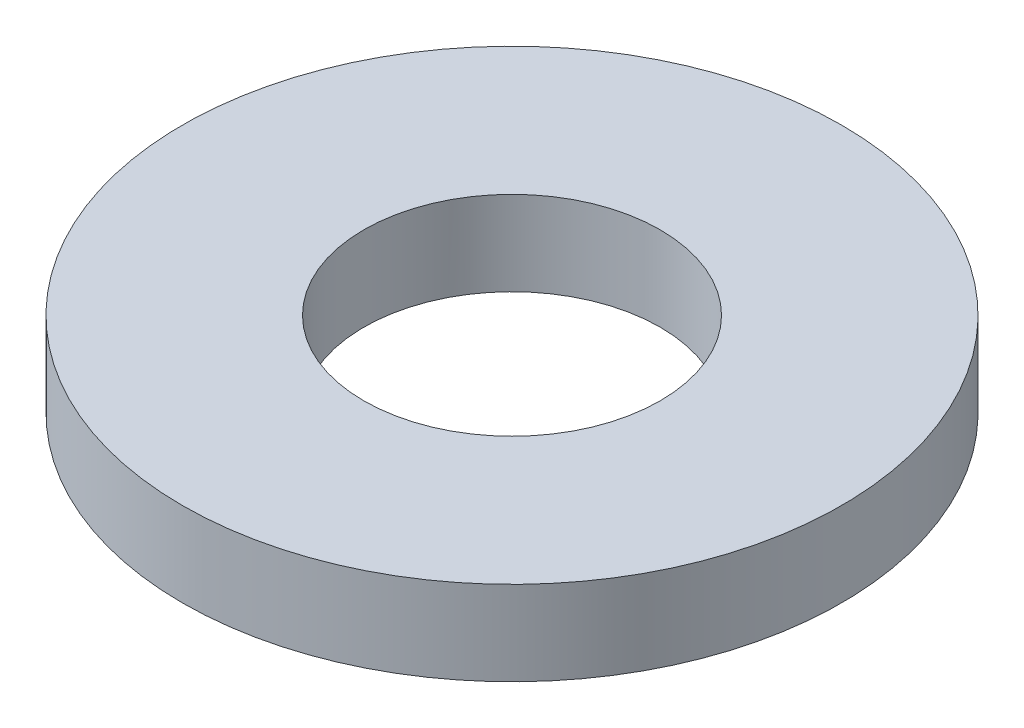
ISO-10303-21;
HEADER;
FILE_DESCRIPTION(('STEP AP214'),'2;1');
FILE_NAME('part.step','',(''),(''),'','','');
FILE_SCHEMA(('AUTOMOTIVE_DESIGN { 1 0 10303 214 1 1 1 1 }'));
ENDSEC;
DATA;
#1=APPLICATION_CONTEXT('core data for automotive mechanical design processes');
#2=APPLICATION_PROTOCOL_DEFINITION('international standard','automotive_design',2000,#1);
#3=PRODUCT_CONTEXT('',#1,'mechanical');
#4=PRODUCT('Part','Part','',(#3));
#5=PRODUCT_RELATED_PRODUCT_CATEGORY('part','',(#4));
#6=PRODUCT_DEFINITION_FORMATION('','',#4);
#7=PRODUCT_DEFINITION_CONTEXT('part definition',#1,'design');
#8=PRODUCT_DEFINITION('design','',#6,#7);
#9=PRODUCT_DEFINITION_SHAPE('','',#8);
#10=(LENGTH_UNIT() NAMED_UNIT(*) SI_UNIT(.MILLI.,.METRE.));
#11=(NAMED_UNIT(*) PLANE_ANGLE_UNIT() SI_UNIT($,.RADIAN.));
#12=(NAMED_UNIT(*) SI_UNIT($,.STERADIAN.) SOLID_ANGLE_UNIT());
#13=UNCERTAINTY_MEASURE_WITH_UNIT(LENGTH_MEASURE(1.E-05),#10,'distance_accuracy_value','');
#14=(GEOMETRIC_REPRESENTATION_CONTEXT(3) GLOBAL_UNCERTAINTY_ASSIGNED_CONTEXT((#13)) GLOBAL_UNIT_ASSIGNED_CONTEXT((#10,
#11,#12)) REPRESENTATION_CONTEXT('',''));
#15=CARTESIAN_POINT('',(0.,0.,0.));
#16=DIRECTION('',(0.,0.,1.));
#17=DIRECTION('',(1.,0.,0.));
#18=AXIS2_PLACEMENT_3D('',#15,#16,#17);
#19=CARTESIAN_POINT('',(0.,2.032,0.));
#20=DIRECTION('',(0.,-1.,0.));
#21=DIRECTION('',(0.,0.,-1.));
#22=AXIS2_PLACEMENT_3D('',#19,#20,#21);
#23=CYLINDRICAL_SURFACE('',#22,7.9375);
#24=CARTESIAN_POINT('',(0.,2.032,0.));
#25=DIRECTION('',(0.,1.,0.));
#26=DIRECTION('',(0.,0.,1.));
#27=AXIS2_PLACEMENT_3D('',#24,#25,#26);
#28=CIRCLE('',#27,7.9375);
#29=CARTESIAN_POINT('',(0.,2.032,7.9375));
#30=VERTEX_POINT('',#29);
#31=EDGE_CURVE('E10',#30,#30,#28,.T.);
#32=ORIENTED_EDGE('',*,*,#31,.F.);
#33=EDGE_LOOP('',(#32));
#34=FACE_BOUND('',#33,.T.);
#35=CARTESIAN_POINT('',(0.,0.,0.));
#36=DIRECTION('',(0.,1.,0.));
#37=DIRECTION('',(0.,0.,1.));
#38=AXIS2_PLACEMENT_3D('',#35,#36,#37);
#39=CIRCLE('',#38,7.9375);
#40=CARTESIAN_POINT('',(0.,0.,7.9375));
#41=VERTEX_POINT('',#40);
#42=EDGE_CURVE('E37',#41,#41,#39,.T.);
#43=ORIENTED_EDGE('',*,*,#42,.T.);
#44=EDGE_LOOP('',(#43));
#45=FACE_BOUND('',#44,.T.);
#46=ADVANCED_FACE('F34',(#34,#45),#23,.T.);
#47=CARTESIAN_POINT('',(0.,2.032,0.));
#48=DIRECTION('',(0.,1.,0.));
#49=DIRECTION('',(0.,0.,1.));
#50=AXIS2_PLACEMENT_3D('',#47,#48,#49);
#51=PLANE('',#50);
#52=CARTESIAN_POINT('',(0.,2.032,0.));
#53=DIRECTION('',(0.,1.,0.));
#54=DIRECTION('',(0.,0.,1.));
#55=AXIS2_PLACEMENT_3D('',#52,#53,#54);
#56=CIRCLE('',#55,3.5687);
#57=CARTESIAN_POINT('',(0.,2.032,3.5687));
#58=VERTEX_POINT('',#57);
#59=EDGE_CURVE('E44',#58,#58,#56,.T.);
#60=ORIENTED_EDGE('',*,*,#59,.F.);
#61=EDGE_LOOP('',(#60));
#62=FACE_BOUND('',#61,.T.);
#63=ORIENTED_EDGE('',*,*,#31,.T.);
#64=EDGE_LOOP('',(#63));
#65=FACE_BOUND('',#64,.T.);
#66=ADVANCED_FACE('F57',(#62,#65),#51,.T.);
#67=CARTESIAN_POINT('',(0.,0.,0.));
#68=DIRECTION('',(0.,1.,0.));
#69=DIRECTION('',(0.,0.,1.));
#70=AXIS2_PLACEMENT_3D('',#67,#68,#69);
#71=PLANE('',#70);
#72=CARTESIAN_POINT('',(0.,0.,0.));
#73=DIRECTION('',(0.,-1.,0.));
#74=DIRECTION('',(0.,0.,-1.));
#75=AXIS2_PLACEMENT_3D('',#72,#73,#74);
#76=CIRCLE('',#75,3.5687);
#77=CARTESIAN_POINT('',(0.,0.,-3.5687));
#78=VERTEX_POINT('',#77);
#79=EDGE_CURVE('E48',#78,#78,#76,.T.);
#80=ORIENTED_EDGE('',*,*,#79,.F.);
#81=EDGE_LOOP('',(#80));
#82=FACE_BOUND('',#81,.T.);
#83=ORIENTED_EDGE('',*,*,#42,.F.);
#84=EDGE_LOOP('',(#83));
#85=FACE_BOUND('',#84,.T.);
#86=ADVANCED_FACE('F54',(#82,#85),#71,.F.);
#87=CARTESIAN_POINT('',(0.,3.302,0.));
#88=DIRECTION('',(0.,-1.,0.));
#89=DIRECTION('',(0.,0.,-1.));
#90=AXIS2_PLACEMENT_3D('',#87,#88,#89);
#91=CYLINDRICAL_SURFACE('',#90,3.5687);
#92=ORIENTED_EDGE('',*,*,#59,.T.);
#93=EDGE_LOOP('',(#92));
#94=FACE_BOUND('',#93,.T.);
#95=ORIENTED_EDGE('',*,*,#79,.T.);
#96=EDGE_LOOP('',(#95));
#97=FACE_BOUND('',#96,.T.);
#98=ADVANCED_FACE('F52',(#94,#97),#91,.F.);
#99=CLOSED_SHELL('',(#46,#66,#86,#98));
#100=MANIFOLD_SOLID_BREP('B2',#99);
#101=ADVANCED_BREP_SHAPE_REPRESENTATION('',(#18,#100),#14);
#102=SHAPE_DEFINITION_REPRESENTATION(#9,#101);
ENDSEC;
END-ISO-10303-21;
